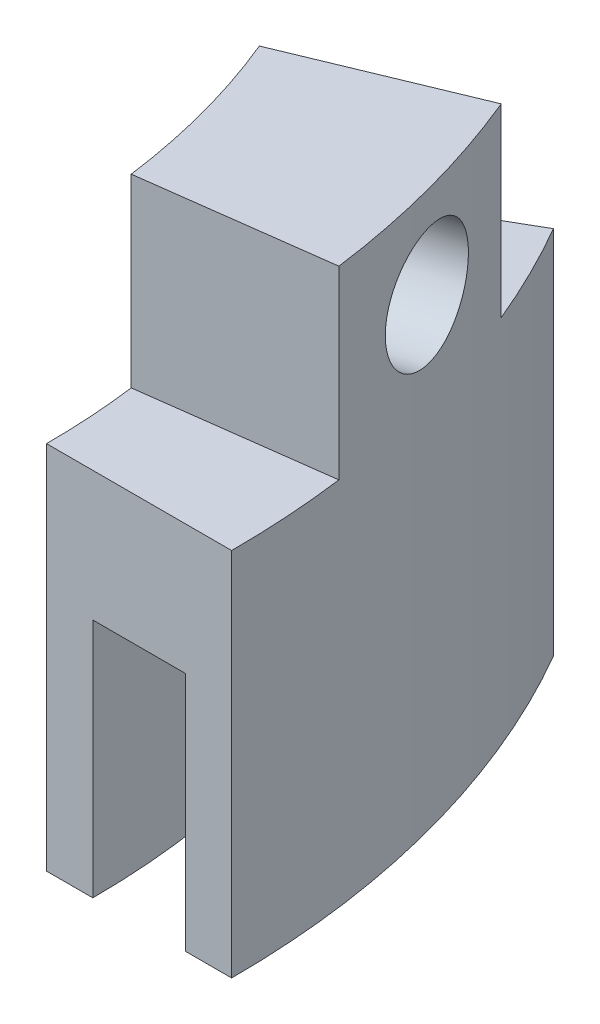
ISO-10303-21;
HEADER;
FILE_DESCRIPTION(('STEP AP214'),'2;1');
FILE_NAME('part.step','',(''),(''),'','','');
FILE_SCHEMA(('AUTOMOTIVE_DESIGN { 1 0 10303 214 1 1 1 1 }'));
ENDSEC;
DATA;
#1=APPLICATION_CONTEXT('core data for automotive mechanical design processes');
#2=APPLICATION_PROTOCOL_DEFINITION('international standard','automotive_design',2000,#1);
#3=PRODUCT_CONTEXT('',#1,'mechanical');
#4=PRODUCT('Part','Part','',(#3));
#5=PRODUCT_RELATED_PRODUCT_CATEGORY('part','',(#4));
#6=PRODUCT_DEFINITION_FORMATION('','',#4);
#7=PRODUCT_DEFINITION_CONTEXT('part definition',#1,'design');
#8=PRODUCT_DEFINITION('design','',#6,#7);
#9=PRODUCT_DEFINITION_SHAPE('','',#8);
#10=(LENGTH_UNIT() NAMED_UNIT(*) SI_UNIT(.MILLI.,.METRE.));
#11=(NAMED_UNIT(*) PLANE_ANGLE_UNIT() SI_UNIT($,.RADIAN.));
#12=(NAMED_UNIT(*) SI_UNIT($,.STERADIAN.) SOLID_ANGLE_UNIT());
#13=UNCERTAINTY_MEASURE_WITH_UNIT(LENGTH_MEASURE(1.E-05),#10,'distance_accuracy_value','');
#14=(GEOMETRIC_REPRESENTATION_CONTEXT(3) GLOBAL_UNCERTAINTY_ASSIGNED_CONTEXT((#13)) GLOBAL_UNIT_ASSIGNED_CONTEXT((#10,
#11,#12)) REPRESENTATION_CONTEXT('',''));
#15=CARTESIAN_POINT('',(0.,0.,0.));
#16=DIRECTION('',(0.,0.,1.));
#17=DIRECTION('',(1.,0.,0.));
#18=AXIS2_PLACEMENT_3D('',#15,#16,#17);
#19=CARTESIAN_POINT('',(37.5,30.,0.));
#20=DIRECTION('',(0.,0.,-1.));
#21=DIRECTION('',(-1.,0.,0.));
#22=AXIS2_PLACEMENT_3D('',#19,#20,#21);
#23=PLANE('',#22);
#24=DIRECTION('',(-1.,0.,0.));
#25=VECTOR('',#24,1.);
#26=CARTESIAN_POINT('',(47.5,20.,0.));
#27=LINE('',#26,#25);
#28=CARTESIAN_POINT('',(47.5,20.,0.));
#29=VERTEX_POINT('',#28);
#30=CARTESIAN_POINT('',(37.5,20.,0.));
#31=VERTEX_POINT('',#30);
#32=EDGE_CURVE('E144',#29,#31,#27,.T.);
#33=ORIENTED_EDGE('',*,*,#32,.T.);
#34=DIRECTION('',(0.,-1.,0.));
#35=VECTOR('',#34,1.);
#36=CARTESIAN_POINT('',(37.5,30.,0.));
#37=LINE('',#36,#35);
#38=CARTESIAN_POINT('',(37.5,0.,0.));
#39=VERTEX_POINT('',#38);
#40=EDGE_CURVE('E50',#31,#39,#37,.T.);
#41=ORIENTED_EDGE('',*,*,#40,.T.);
#42=DIRECTION('',(1.,0.,0.));
#43=VECTOR('',#42,1.);
#44=CARTESIAN_POINT('',(37.5,0.,0.));
#45=LINE('',#44,#43);
#46=CARTESIAN_POINT('',(40.,0.,0.));
#47=VERTEX_POINT('',#46);
#48=EDGE_CURVE('E209',#39,#47,#45,.T.);
#49=ORIENTED_EDGE('',*,*,#48,.T.);
#50=DIRECTION('',(0.,-1.,0.));
#51=VECTOR('',#50,1.);
#52=CARTESIAN_POINT('',(40.,13.,0.));
#53=LINE('',#52,#51);
#54=CARTESIAN_POINT('',(40.,13.,0.));
#55=VERTEX_POINT('',#54);
#56=EDGE_CURVE('E197',#55,#47,#53,.T.);
#57=ORIENTED_EDGE('',*,*,#56,.F.);
#58=DIRECTION('',(1.,0.,0.));
#59=VECTOR('',#58,1.);
#60=CARTESIAN_POINT('',(40.,13.,0.));
#61=LINE('',#60,#59);
#62=CARTESIAN_POINT('',(45.,13.,0.));
#63=VERTEX_POINT('',#62);
#64=EDGE_CURVE('E176',#55,#63,#61,.T.);
#65=ORIENTED_EDGE('',*,*,#64,.T.);
#66=DIRECTION('',(0.,-1.,0.));
#67=VECTOR('',#66,1.);
#68=CARTESIAN_POINT('',(45.,13.,0.));
#69=LINE('',#68,#67);
#70=CARTESIAN_POINT('',(45.,0.,0.));
#71=VERTEX_POINT('',#70);
#72=EDGE_CURVE('E194',#63,#71,#69,.T.);
#73=ORIENTED_EDGE('',*,*,#72,.T.);
#74=CARTESIAN_POINT('',(47.5,0.,0.));
#75=VERTEX_POINT('',#74);
#76=EDGE_CURVE('E208',#71,#75,#45,.T.);
#77=ORIENTED_EDGE('',*,*,#76,.T.);
#78=DIRECTION('',(0.,-1.,0.));
#79=VECTOR('',#78,1.);
#80=CARTESIAN_POINT('',(47.5,30.,0.));
#81=LINE('',#80,#79);
#82=EDGE_CURVE('E221',#29,#75,#81,.T.);
#83=ORIENTED_EDGE('',*,*,#82,.F.);
#84=EDGE_LOOP('',(#33,#41,#49,#57,#65,#73,#77,#83));
#85=FACE_BOUND('',#84,.T.);
#86=ADVANCED_FACE('F36',(#85),#23,.F.);
#87=CARTESIAN_POINT('',(0.,30.,0.));
#88=DIRECTION('',(0.,-1.,0.));
#89=DIRECTION('',(0.,0.,-1.));
#90=AXIS2_PLACEMENT_3D('',#87,#88,#89);
#91=CYLINDRICAL_SURFACE('',#90,37.5);
#92=CARTESIAN_POINT('',(35.2704060324565,25.,-12.7376786859166));
#93=CARTESIAN_POINT('',(35.2704097653844,25.1779978891608,-12.7376716408698));
#94=CARTESIAN_POINT('',(35.2755349748384,25.3561167010307,-12.7235043498026));
#95=CARTESIAN_POINT('',(35.2958024335006,25.7074252721116,-12.6671698499681));
#96=CARTESIAN_POINT('',(35.310956009995,25.8806092262858,-12.6249709786409));
#97=CARTESIAN_POINT('',(35.3505338022705,26.2169091534095,-12.5137214601811));
#98=CARTESIAN_POINT('',(35.3749527353968,26.3800308018977,-12.4446861133498));
#99=CARTESIAN_POINT('',(35.4318935830824,26.69166654265,-12.2816260753014));
#100=CARTESIAN_POINT('',(35.4644137742792,26.8401837323281,-12.1876066985978));
#101=CARTESIAN_POINT('',(35.5361514233242,27.1188261762729,-11.9768246317122));
#102=CARTESIAN_POINT('',(35.5753844170809,27.2489074566124,-11.8600090925989));
#103=CARTESIAN_POINT('',(35.658768247816,27.4866077028728,-11.6068930067202));
#104=CARTESIAN_POINT('',(35.7029193002565,27.5942256840735,-11.4705916061972));
#105=CARTESIAN_POINT('',(35.7943662403452,27.7840912508375,-11.1819614568014));
#106=CARTESIAN_POINT('',(35.8416667259955,27.8663007084706,-11.0296090768136));
#107=CARTESIAN_POINT('',(35.9375032521241,28.0027717156793,-10.7132232423583));
#108=CARTESIAN_POINT('',(35.9860392703385,28.0570337684841,-10.5491899982805));
#109=CARTESIAN_POINT('',(36.0824862424699,28.1359428644353,-10.2144231425898));
#110=CARTESIAN_POINT('',(36.1303984234407,28.1606611562039,-10.0437066804902));
#111=CARTESIAN_POINT('',(36.2241803613751,28.1800013365684,-9.70002470119819));
#112=CARTESIAN_POINT('',(36.2700501574028,28.1746238010489,-9.52705922710394));
#113=CARTESIAN_POINT('',(36.3583621276763,28.1339832131042,-9.18426699791521));
#114=CARTESIAN_POINT('',(36.4008127840267,28.0987967778475,-9.01443333559827));
#115=CARTESIAN_POINT('',(36.4814547002396,27.9996563534648,-8.68232021854286));
#116=CARTESIAN_POINT('',(36.5196459184645,27.9357020831535,-8.52004083765927));
#117=CARTESIAN_POINT('',(36.591152506488,27.7807561260629,-8.20751588121255));
#118=CARTESIAN_POINT('',(36.6244616132793,27.6897301558397,-8.05728587305103));
#119=CARTESIAN_POINT('',(36.6857555613364,27.4832495856142,-7.77344556382491));
#120=CARTESIAN_POINT('',(36.7137402910436,27.3677944738694,-7.63983561101087));
#121=CARTESIAN_POINT('',(36.7642925057259,27.1153012158688,-7.39275221368527));
#122=CARTESIAN_POINT('',(36.7868427184138,26.9781964886148,-7.27934326347325));
#123=CARTESIAN_POINT('',(36.8263918552036,26.6865278463528,-7.07655084451197));
#124=CARTESIAN_POINT('',(36.8433907745121,26.5319639162695,-6.98716739650801));
#125=CARTESIAN_POINT('',(36.871903253683,26.2097171671351,-6.83511267389838));
#126=CARTESIAN_POINT('',(36.883416105588,26.0420326581687,-6.77244484695834));
#127=CARTESIAN_POINT('',(36.901038571056,25.6983272854993,-6.67576128321446));
#128=CARTESIAN_POINT('',(36.9071483019301,25.5223066028764,-6.64174492433843));
#129=CARTESIAN_POINT('',(36.9140145581421,25.1675098476037,-6.60347738194785));
#130=CARTESIAN_POINT('',(36.9147876263553,24.9887440130366,-6.59913421629608));
#131=CARTESIAN_POINT('',(36.9110327318272,24.6330181011827,-6.62010360202808));
#132=CARTESIAN_POINT('',(36.9065048201497,24.456058006518,-6.64541586774397));
#133=CARTESIAN_POINT('',(36.8921124053528,24.1092344846523,-6.72485322684918));
#134=CARTESIAN_POINT('',(36.8822558492378,23.9393608941768,-6.77893541159788));
#135=CARTESIAN_POINT('',(36.8571301596593,23.61121756518,-6.91423628346922));
#136=CARTESIAN_POINT('',(36.8418609365965,23.4529480188003,-6.99545541980593));
#137=CARTESIAN_POINT('',(36.8057900762903,23.1520794266476,-7.18282022182036));
#138=CARTESIAN_POINT('',(36.7849749694499,23.009519744213,-7.28902650069915));
#139=CARTESIAN_POINT('',(36.7378166112305,22.7445155632007,-7.52310090241077));
#140=CARTESIAN_POINT('',(36.7114732616809,22.622071421904,-7.65096940991407));
#141=CARTESIAN_POINT('',(36.6533017913043,22.4004559414546,-7.92496656070223));
#142=CARTESIAN_POINT('',(36.6214597694007,22.3013451292424,-8.07114121956292));
#143=CARTESIAN_POINT('',(36.5526595330129,22.129625086973,-8.37721019714513));
#144=CARTESIAN_POINT('',(36.5157013710748,22.0570155847572,-8.53710437495147));
#145=CARTESIAN_POINT('',(36.437304422082,21.9404631237462,-8.86573866446494));
#146=CARTESIAN_POINT('',(36.3958715578333,21.8964828000683,-9.03446693432316));
#147=CARTESIAN_POINT('',(36.3093686696427,21.8383150280743,-9.37607470537412));
#148=CARTESIAN_POINT('',(36.2642987170066,21.8241269958212,-9.54895412513603));
#149=CARTESIAN_POINT('',(36.1718569325052,21.8259534651701,-9.89335425158622));
#150=CARTESIAN_POINT('',(36.1244927390473,21.8418736653132,-10.0648775165041));
#151=CARTESIAN_POINT('',(36.0287882203176,21.9032679530679,-10.4022680294759));
#152=CARTESIAN_POINT('',(35.9804478937554,21.948742079748,-10.5681352700524));
#153=CARTESIAN_POINT('',(35.8844665121526,22.0679292432081,-10.8895924155276));
#154=CARTESIAN_POINT('',(35.8368254133026,22.1416405029097,-11.045182966458));
#155=CARTESIAN_POINT('',(35.7440435832514,22.3151988006724,-11.3418488536084));
#156=CARTESIAN_POINT('',(35.6989028143671,22.4150454447114,-11.4829244086144));
#157=CARTESIAN_POINT('',(35.6128266822784,22.6383942434046,-11.7471689313545));
#158=CARTESIAN_POINT('',(35.5719042956936,22.7619662296959,-11.8702831017985));
#159=CARTESIAN_POINT('',(35.4961846180603,23.0291306432559,-12.0948319233656));
#160=CARTESIAN_POINT('',(35.4613888117427,23.1727279084336,-12.1962613206179));
#161=CARTESIAN_POINT('',(35.3994594406154,23.4761541158721,-12.3748637066046));
#162=CARTESIAN_POINT('',(35.3723407289385,23.636013720463,-12.4519897068952));
#163=CARTESIAN_POINT('',(35.3271692387112,23.9670953803168,-12.5795761749517));
#164=CARTESIAN_POINT('',(35.3091060526232,24.1383041344437,-12.6300672577978));
#165=CARTESIAN_POINT('',(35.28752135546,24.4254333749889,-12.6902098217164));
#166=CARTESIAN_POINT('',(35.2811166952536,24.5395079589269,-12.7079882841098));
#167=CARTESIAN_POINT('',(35.2725578284966,24.769038057731,-12.7317249855531));
#168=CARTESIAN_POINT('',(35.2704036100842,24.8844935687424,-12.73768325759));
#169=CARTESIAN_POINT('',(35.2704060324565,25.,-12.7376786859166));
#170=B_SPLINE_CURVE_WITH_KNOTS('',3,(#92,#93,#94,#95,#96,#97,#98,#99,#100,#101,#102,#103,#104,
#105,#106,#107,#108,#109,#110,#111,#112,#113,#114,#115,#116,#117,#118,#119,#120,#121,#122,#123,
#124,#125,#126,#127,#128,#129,#130,#131,#132,#133,#134,#135,#136,#137,#138,#139,#140,#141,#142,
#143,#144,#145,#146,#147,#148,#149,#150,#151,#152,#153,#154,#155,#156,#157,#158,#159,#160,#161,
#162,#163,#164,#165,#166,#167,#168,#169),.UNSPECIFIED.,.T.,.F.,(4,2,2,2,2,2,2,2,2,2,2,2,2,2,2,2,
2,2,2,2,2,2,2,2,2,2,2,2,2,2,2,2,2,2,2,2,2,2,4),(0.,0.533571926366941,1.06774756630856,
1.60161910186992,2.13537716496338,2.67038767753384,3.2054216383574,3.74125461404554,
4.27707794102814,4.81160643609804,5.34612470298305,5.87927326287136,6.41242703402442,
6.94625888407069,7.48010191795112,8.01561990371666,8.55113835188457,9.08672588809823,
9.62230179549409,10.1562167472371,10.6901265558716,11.2232422928354,11.7563668552177,
12.2907982405197,12.8252391170668,13.3610514295973,13.8968582393801,14.4319643405063,
14.9670599533105,15.5004823777874,16.0339055074187,16.5672950720633,17.1006765956896,
17.6356527982051,18.1707584702988,18.7068924621637,19.2424088531516,19.5886554368666,
19.9349010542976),.UNSPECIFIED.);
#171=CARTESIAN_POINT('',(35.2704060324565,25.,-12.7376786859166));
#172=VERTEX_POINT('',#171);
#173=EDGE_CURVE('E260',#172,#172,#170,.T.);
#174=ORIENTED_EDGE('',*,*,#173,.T.);
#175=EDGE_LOOP('',(#174));
#176=FACE_BOUND('',#175,.T.);
#177=DIRECTION('',(0.,1.,0.));
#178=VECTOR('',#177,1.);
#179=CARTESIAN_POINT('',(37.1791823015179,20.,-4.8947322082519));
#180=LINE('',#179,#178);
#181=CARTESIAN_POINT('',(37.1791823015179,20.,-4.8947322082519));
#182=VERTEX_POINT('',#181);
#183=CARTESIAN_POINT('',(37.1791823015179,30.,-4.8947322082519));
#184=VERTEX_POINT('',#183);
#185=EDGE_CURVE('E135',#182,#184,#180,.T.);
#186=ORIENTED_EDGE('',*,*,#185,.T.);
#187=CARTESIAN_POINT('',(0.,30.,0.));
#188=DIRECTION('',(0.,-1.,0.));
#189=DIRECTION('',(0.,0.,1.));
#190=AXIS2_PLACEMENT_3D('',#187,#188,#189);
#191=CIRCLE('',#190,37.5);
#192=CARTESIAN_POINT('',(34.6454824691732,30.,-14.3506287136909));
#193=VERTEX_POINT('',#192);
#194=EDGE_CURVE('E200',#193,#184,#191,.T.);
#195=ORIENTED_EDGE('',*,*,#194,.F.);
#196=DIRECTION('',(0.,1.,0.));
#197=VECTOR('',#196,1.);
#198=CARTESIAN_POINT('',(34.6454824691732,20.,-14.3506287136909));
#199=LINE('',#198,#197);
#200=CARTESIAN_POINT('',(34.6454824691732,20.,-14.3506287136909));
#201=VERTEX_POINT('',#200);
#202=EDGE_CURVE('E65',#201,#193,#199,.T.);
#203=ORIENTED_EDGE('',*,*,#202,.F.);
#204=CARTESIAN_POINT('',(0.,20.,0.));
#205=DIRECTION('',(0.,-1.,0.));
#206=DIRECTION('',(0.,0.,1.));
#207=AXIS2_PLACEMENT_3D('',#204,#205,#206);
#208=CIRCLE('',#207,37.5);
#209=CARTESIAN_POINT('',(32.4759526419164,20.,-18.75));
#210=VERTEX_POINT('',#209);
#211=EDGE_CURVE('E163',#210,#201,#208,.T.);
#212=ORIENTED_EDGE('',*,*,#211,.F.);
#213=DIRECTION('',(0.,-1.,0.));
#214=VECTOR('',#213,1.);
#215=CARTESIAN_POINT('',(32.4759526419164,30.,-18.75));
#216=LINE('',#215,#214);
#217=CARTESIAN_POINT('',(32.4759526419164,0.,-18.75));
#218=VERTEX_POINT('',#217);
#219=EDGE_CURVE('E205',#210,#218,#216,.T.);
#220=ORIENTED_EDGE('',*,*,#219,.T.);
#221=CARTESIAN_POINT('',(0.,0.,0.));
#222=DIRECTION('',(0.,-1.,0.));
#223=DIRECTION('',(0.,0.,1.));
#224=AXIS2_PLACEMENT_3D('',#221,#222,#223);
#225=CIRCLE('',#224,37.5);
#226=EDGE_CURVE('E199',#218,#39,#225,.T.);
#227=ORIENTED_EDGE('',*,*,#226,.T.);
#228=ORIENTED_EDGE('',*,*,#40,.F.);
#229=CARTESIAN_POINT('',(0.,20.,0.));
#230=DIRECTION('',(0.,1.,0.));
#231=DIRECTION('',(-0.500000000000001,0.,-0.866025403784438));
#232=AXIS2_PLACEMENT_3D('',#229,#230,#231);
#233=CIRCLE('',#232,37.5);
#234=EDGE_CURVE('E138',#31,#182,#233,.T.);
#235=ORIENTED_EDGE('',*,*,#234,.T.);
#236=EDGE_LOOP('',(#186,#195,#203,#212,#220,#227,#228,#235));
#237=FACE_BOUND('',#236,.T.);
#238=ADVANCED_FACE('F38',(#176,#237),#91,.F.);
#239=CARTESIAN_POINT('',(0.,30.,0.));
#240=DIRECTION('',(0.,-1.,0.));
#241=DIRECTION('',(0.,0.,-1.));
#242=AXIS2_PLACEMENT_3D('',#239,#240,#241);
#243=CYLINDRICAL_SURFACE('',#242,47.5);
#244=CARTESIAN_POINT('',(44.9571153704844,25.,-15.3332246303561));
#245=CARTESIAN_POINT('',(44.9571187668989,24.8218727170466,-15.3332174361785));
#246=CARTESIAN_POINT('',(44.9619886090917,24.6436213477172,-15.3189592163519));
#247=CARTESIAN_POINT('',(44.9812644094683,24.2920424228411,-15.2622643802337));
#248=CARTESIAN_POINT('',(44.995681412819,24.1187208130721,-15.219795126254));
#249=CARTESIAN_POINT('',(45.0333944950656,23.7821448482159,-15.1078406403738));
#250=CARTESIAN_POINT('',(45.0566858228782,23.6188851604766,-15.0383698639897));
#251=CARTESIAN_POINT('',(45.111111088111,23.3070005572629,-14.8743097257609));
#252=CARTESIAN_POINT('',(45.142243251731,23.1583723423333,-14.7797260448441));
#253=CARTESIAN_POINT('',(45.2110693614084,22.8796750858532,-14.5678275116204));
#254=CARTESIAN_POINT('',(45.2487730882863,22.7496342415522,-14.4504787469334));
#255=CARTESIAN_POINT('',(45.3291547528529,22.5120446398517,-14.1963184218899));
#256=CARTESIAN_POINT('',(45.3718328996932,22.4044968287126,-14.0595060431245));
#257=CARTESIAN_POINT('',(45.4605259195841,22.2148580644146,-13.7700212845367));
#258=CARTESIAN_POINT('',(45.5065438297487,22.1327906497476,-13.6173344127912));
#259=CARTESIAN_POINT('',(45.6001749156534,21.9965929455987,-13.3004255135691));
#260=CARTESIAN_POINT('',(45.64778807231,21.9424623220415,-13.136203624058));
#261=CARTESIAN_POINT('',(45.7428989305853,21.8637535796711,-12.8010732040241));
#262=CARTESIAN_POINT('',(45.7903966980237,21.8391310071299,-12.6301751332535));
#263=CARTESIAN_POINT('',(45.8838625199052,21.8200000043306,-12.2862892396115));
#264=CARTESIAN_POINT('',(45.9298305936583,21.8254911937878,-12.1133014431573));
#265=CARTESIAN_POINT('',(46.0188866345685,21.8663952317931,-11.7704461717246));
#266=CARTESIAN_POINT('',(46.0619790855201,21.9017602649988,-11.6005741533717));
#267=CARTESIAN_POINT('',(46.1443334263227,22.0013338785164,-11.2685301791647));
#268=CARTESIAN_POINT('',(46.183595290933,22.0655426488711,-11.1063582740521));
#269=CARTESIAN_POINT('',(46.2575376526101,22.2210350718874,-10.7942567898834));
#270=CARTESIAN_POINT('',(46.2922144589287,22.3123403464186,-10.6443371098954));
#271=CARTESIAN_POINT('',(46.3564038646079,22.519418233548,-10.361222219855));
#272=CARTESIAN_POINT('',(46.3859163972114,22.6351911623899,-10.2280272260042));
#273=CARTESIAN_POINT('',(46.4394832919698,22.8881879374392,-9.98199931411864));
#274=CARTESIAN_POINT('',(46.4635268662361,23.0254532941587,-9.86920672938207));
#275=CARTESIAN_POINT('',(46.5058875622847,23.3173931764798,-9.66762978139927));
#276=CARTESIAN_POINT('',(46.5242046814203,23.472067710128,-9.57884542924983));
#277=CARTESIAN_POINT('',(46.5550235806884,23.7944623562233,-9.42792352642444));
#278=CARTESIAN_POINT('',(46.5675249693619,23.9621833459457,-9.36578776949785));
#279=CARTESIAN_POINT('',(46.586679435613,24.3058974189124,-9.27004335561848));
#280=CARTESIAN_POINT('',(46.5933325919434,24.4818903907321,-9.23643431452387));
#281=CARTESIAN_POINT('',(46.6007776837091,24.8367882327187,-9.19879852644343));
#282=CARTESIAN_POINT('',(46.6015809302342,25.0156868127678,-9.19471469112511));
#283=CARTESIAN_POINT('',(46.5973558838729,25.3716378877592,-9.21610215042586));
#284=CARTESIAN_POINT('',(46.5923276257594,25.5486903937032,-9.24157326881031));
#285=CARTESIAN_POINT('',(46.5764500807797,25.8957587744632,-9.32126220165982));
#286=CARTESIAN_POINT('',(46.5656061249852,26.0657809402785,-9.37545368850772));
#287=CARTESIAN_POINT('',(46.5381214970428,26.3941566410379,-9.51094096276121));
#288=CARTESIAN_POINT('',(46.5214807647812,26.5525100549545,-9.59223703124576));
#289=CARTESIAN_POINT('',(46.4824411600192,26.8533197380915,-9.7796628890173));
#290=CARTESIAN_POINT('',(46.4600334975505,26.9957512595443,-9.88583056529914));
#291=CARTESIAN_POINT('',(46.4096312497907,27.2604245975693,-10.1198028848125));
#292=CARTESIAN_POINT('',(46.3816366021736,27.3826661888836,-10.2476077694167));
#293=CARTESIAN_POINT('',(46.3203096229611,27.6036862096596,-10.5213393873906));
#294=CARTESIAN_POINT('',(46.2869688772683,27.7024270329566,-10.6672946044873));
#295=CARTESIAN_POINT('',(46.2154706029459,27.873385167033,-10.9729154273159));
#296=CARTESIAN_POINT('',(46.1773131074825,27.9456026604285,-11.1325809386414));
#297=CARTESIAN_POINT('',(46.0969329405165,28.0613988837534,-11.460858736013));
#298=CARTESIAN_POINT('',(46.0547136663557,28.1050013131004,-11.6294634930273));
#299=CARTESIAN_POINT('',(45.9671516423718,28.1624072360458,-11.9708819515651));
#300=CARTESIAN_POINT('',(45.9218089285259,28.1762110728192,-12.1436956045938));
#301=CARTESIAN_POINT('',(45.8293077611885,28.173624537442,-12.4882467935225));
#302=CARTESIAN_POINT('',(45.7821530194752,28.1572929713933,-12.6599857704587));
#303=CARTESIAN_POINT('',(45.6873731237853,28.095021282724,-12.9978743727564));
#304=CARTESIAN_POINT('',(45.6397479690106,28.0490811098496,-13.1640239886307));
#305=CARTESIAN_POINT('',(45.5456204380541,27.9289099024438,-13.486090241278));
#306=CARTESIAN_POINT('',(45.4991180455961,27.8546792782925,-13.6420070264494));
#307=CARTESIAN_POINT('',(45.4089181725618,27.6800420813512,-13.9393082245091));
#308=CARTESIAN_POINT('',(45.3652206245557,27.5796361381228,-14.0806929868036));
#309=CARTESIAN_POINT('',(45.2822367875387,27.3552800118789,-14.3453244078452));
#310=CARTESIAN_POINT('',(45.2429587271355,27.2312870301517,-14.4685373609352));
#311=CARTESIAN_POINT('',(45.1704983664336,26.9633394854515,-14.6931974367829));
#312=CARTESIAN_POINT('',(45.1373175572827,26.8193800545357,-14.7946392361887));
#313=CARTESIAN_POINT('',(45.0784365631933,26.5154006883772,-14.9730900787958));
#314=CARTESIAN_POINT('',(45.0527465801876,26.3553592455988,-15.0500658138075));
#315=CARTESIAN_POINT('',(45.0100662158975,26.0240300784201,-15.1772356108915));
#316=CARTESIAN_POINT('',(44.9930656807598,25.852755745355,-15.2274609344368));
#317=CARTESIAN_POINT('',(44.9729368501191,25.5670335490145,-15.2867755169555));
#318=CARTESIAN_POINT('',(44.9670152770581,25.4544309955258,-15.3041723050184));
#319=CARTESIAN_POINT('',(44.959103453802,25.227902561161,-15.3273991540059));
#320=CARTESIAN_POINT('',(44.9571131972515,25.1139766824243,-15.3332292336291));
#321=CARTESIAN_POINT('',(44.9571153704844,25.,-15.3332246303561));
#322=B_SPLINE_CURVE_WITH_KNOTS('',3,(#244,#245,#246,#247,#248,#249,#250,#251,#252,#253,#254,
#255,#256,#257,#258,#259,#260,#261,#262,#263,#264,#265,#266,#267,#268,#269,#270,#271,#272,#273,
#274,#275,#276,#277,#278,#279,#280,#281,#282,#283,#284,#285,#286,#287,#288,#289,#290,#291,#292,
#293,#294,#295,#296,#297,#298,#299,#300,#301,#302,#303,#304,#305,#306,#307,#308,#309,#310,#311,
#312,#313,#314,#315,#316,#317,#318,#319,#320,#321),.UNSPECIFIED.,.T.,.F.,(4,2,2,2,2,2,2,2,2,2,2,
2,2,2,2,2,2,2,2,2,2,2,2,2,2,2,2,2,2,2,2,2,2,2,2,2,2,2,4),(0.,0.533965751443998,1.068550332758,
1.60284911257561,2.13702712856383,2.67200708827642,3.20700954955924,3.74250477937393,
4.27799360545142,4.81267470215686,5.34734904677667,5.88116922272522,6.41499291590715,
6.94924372855675,7.48350144680507,8.01880405757494,8.55410691576564,9.08944580018987,
9.62477747560614,10.1590737852916,10.6933669090132,11.2271710976484,11.7609808220927,
12.2956090495492,12.8302432414173,13.3657272931511,13.9012076579468,14.4362439684442,
14.971274117171,15.5052613141995,16.0392494175498,16.5732297751858,17.1071972908547,
17.6421430960463,18.177219554326,18.7130213780739,19.248195663352,19.5898600184957,
19.9315238213043),.UNSPECIFIED.);
#323=CARTESIAN_POINT('',(44.9571153704844,25.,-15.3332246303561));
#324=VERTEX_POINT('',#323);
#325=EDGE_CURVE('E11',#324,#324,#322,.T.);
#326=ORIENTED_EDGE('',*,*,#325,.T.);
#327=EDGE_LOOP('',(#326));
#328=FACE_BOUND('',#327,.T.);
#329=DIRECTION('',(0.,1.,0.));
#330=VECTOR('',#329,1.);
#331=CARTESIAN_POINT('',(47.093630915256,20.,-6.19999413045242));
#332=LINE('',#331,#330);
#333=CARTESIAN_POINT('',(47.093630915256,20.,-6.19999413045242));
#334=VERTEX_POINT('',#333);
#335=CARTESIAN_POINT('',(47.093630915256,30.,-6.19999413045242));
#336=VERTEX_POINT('',#335);
#337=EDGE_CURVE('E57',#334,#336,#332,.T.);
#338=ORIENTED_EDGE('',*,*,#337,.F.);
#339=CARTESIAN_POINT('',(0.,20.,0.));
#340=DIRECTION('',(0.,-1.,0.));
#341=DIRECTION('',(-0.500000000000001,0.,-0.866025403784438));
#342=AXIS2_PLACEMENT_3D('',#339,#340,#341);
#343=CIRCLE('',#342,47.5);
#344=EDGE_CURVE('E139',#334,#29,#343,.T.);
#345=ORIENTED_EDGE('',*,*,#344,.T.);
#346=ORIENTED_EDGE('',*,*,#82,.T.);
#347=CARTESIAN_POINT('',(0.,0.,0.));
#348=DIRECTION('',(0.,1.,0.));
#349=DIRECTION('',(0.,0.,1.));
#350=AXIS2_PLACEMENT_3D('',#347,#348,#349);
#351=CIRCLE('',#350,47.5);
#352=CARTESIAN_POINT('',(41.1362066797608,0.,-23.7500000000001));
#353=VERTEX_POINT('',#352);
#354=EDGE_CURVE('E212',#75,#353,#351,.T.);
#355=ORIENTED_EDGE('',*,*,#354,.T.);
#356=DIRECTION('',(0.,-1.,0.));
#357=VECTOR('',#356,1.);
#358=CARTESIAN_POINT('',(41.1362066797608,30.,-23.7500000000001));
#359=LINE('',#358,#357);
#360=CARTESIAN_POINT('',(41.1362066797608,20.,-23.7500000000001));
#361=VERTEX_POINT('',#360);
#362=EDGE_CURVE('E219',#361,#353,#359,.T.);
#363=ORIENTED_EDGE('',*,*,#362,.F.);
#364=CARTESIAN_POINT('',(0.,20.,0.));
#365=DIRECTION('',(0.,1.,0.));
#366=DIRECTION('',(0.,0.,1.));
#367=AXIS2_PLACEMENT_3D('',#364,#365,#366);
#368=CIRCLE('',#367,47.5);
#369=CARTESIAN_POINT('',(43.8842777942861,20.,-18.1774630373418));
#370=VERTEX_POINT('',#369);
#371=EDGE_CURVE('E159',#370,#361,#368,.T.);
#372=ORIENTED_EDGE('',*,*,#371,.F.);
#373=DIRECTION('',(0.,1.,0.));
#374=VECTOR('',#373,1.);
#375=CARTESIAN_POINT('',(43.8842777942861,20.,-18.1774630373418));
#376=LINE('',#375,#374);
#377=CARTESIAN_POINT('',(43.8842777942861,30.,-18.1774630373418));
#378=VERTEX_POINT('',#377);
#379=EDGE_CURVE('E169',#370,#378,#376,.T.);
#380=ORIENTED_EDGE('',*,*,#379,.T.);
#381=CARTESIAN_POINT('',(0.,30.,0.));
#382=DIRECTION('',(0.,1.,0.));
#383=DIRECTION('',(0.,0.,1.));
#384=AXIS2_PLACEMENT_3D('',#381,#382,#383);
#385=CIRCLE('',#384,47.5);
#386=EDGE_CURVE('E152',#336,#378,#385,.T.);
#387=ORIENTED_EDGE('',*,*,#386,.F.);
#388=EDGE_LOOP('',(#338,#345,#346,#355,#363,#372,#380,#387));
#389=FACE_BOUND('',#388,.T.);
#390=ADVANCED_FACE('F150',(#328,#389),#243,.T.);
#391=CARTESIAN_POINT('',(0.,30.,0.));
#392=DIRECTION('',(0.,1.,0.));
#393=DIRECTION('',(0.,0.,1.));
#394=AXIS2_PLACEMENT_3D('',#391,#392,#393);
#395=PLANE('',#394);
#396=ORIENTED_EDGE('',*,*,#194,.T.);
#397=DIRECTION('',(0.99144486137381,0.,-0.130526192220051));
#398=VECTOR('',#397,1.);
#399=CARTESIAN_POINT('',(47.093630915256,30.,-6.19999413045242));
#400=LINE('',#399,#398);
#401=EDGE_CURVE('E147',#184,#336,#400,.T.);
#402=ORIENTED_EDGE('',*,*,#401,.T.);
#403=ORIENTED_EDGE('',*,*,#386,.T.);
#404=DIRECTION('',(0.923879532511286,0.,-0.382683432365091));
#405=VECTOR('',#404,1.);
#406=CARTESIAN_POINT('',(43.8842777942861,30.,-18.1774630373418));
#407=LINE('',#406,#405);
#408=EDGE_CURVE('E154',#193,#378,#407,.T.);
#409=ORIENTED_EDGE('',*,*,#408,.F.);
#410=EDGE_LOOP('',(#396,#402,#403,#409));
#411=FACE_BOUND('',#410,.T.);
#412=ADVANCED_FACE('F259',(#411),#395,.T.);
#413=CARTESIAN_POINT('',(32.4759526419164,30.,-18.75));
#414=DIRECTION('',(0.500000000000001,0.,0.866025403784438));
#415=DIRECTION('',(0.866025403784438,0.,-0.500000000000001));
#416=AXIS2_PLACEMENT_3D('',#413,#414,#415);
#417=PLANE('',#416);
#418=DIRECTION('',(-0.866025403784438,0.,0.500000000000001));
#419=VECTOR('',#418,1.);
#420=CARTESIAN_POINT('',(41.1362066797608,20.,-23.7500000000001));
#421=LINE('',#420,#419);
#422=EDGE_CURVE('E161',#361,#210,#421,.T.);
#423=ORIENTED_EDGE('',*,*,#422,.F.);
#424=ORIENTED_EDGE('',*,*,#362,.T.);
#425=DIRECTION('',(-0.866025403784438,0.,0.500000000000001));
#426=VECTOR('',#425,1.);
#427=CARTESIAN_POINT('',(32.4759526419164,0.,-18.75));
#428=LINE('',#427,#426);
#429=CARTESIAN_POINT('',(38.9711431702997,0.,-22.5));
#430=VERTEX_POINT('',#429);
#431=EDGE_CURVE('E203',#353,#430,#428,.T.);
#432=ORIENTED_EDGE('',*,*,#431,.T.);
#433=DIRECTION('',(0.,-1.,0.));
#434=VECTOR('',#433,1.);
#435=CARTESIAN_POINT('',(38.9711431702997,13.,-22.5));
#436=LINE('',#435,#434);
#437=CARTESIAN_POINT('',(38.9711431702997,13.,-22.5));
#438=VERTEX_POINT('',#437);
#439=EDGE_CURVE('E192',#438,#430,#436,.T.);
#440=ORIENTED_EDGE('',*,*,#439,.F.);
#441=DIRECTION('',(-0.866025403784438,0.,0.500000000000001));
#442=VECTOR('',#441,1.);
#443=CARTESIAN_POINT('',(34.6410161513775,13.,-20.));
#444=LINE('',#443,#442);
#445=CARTESIAN_POINT('',(34.6410161513775,13.,-20.));
#446=VERTEX_POINT('',#445);
#447=EDGE_CURVE('E182',#438,#446,#444,.T.);
#448=ORIENTED_EDGE('',*,*,#447,.T.);
#449=DIRECTION('',(0.,-1.,0.));
#450=VECTOR('',#449,1.);
#451=CARTESIAN_POINT('',(34.6410161513775,13.,-20.));
#452=LINE('',#451,#450);
#453=CARTESIAN_POINT('',(34.6410161513775,0.,-20.));
#454=VERTEX_POINT('',#453);
#455=EDGE_CURVE('E185',#446,#454,#452,.T.);
#456=ORIENTED_EDGE('',*,*,#455,.T.);
#457=EDGE_CURVE('E215',#454,#218,#428,.T.);
#458=ORIENTED_EDGE('',*,*,#457,.T.);
#459=ORIENTED_EDGE('',*,*,#219,.F.);
#460=EDGE_LOOP('',(#423,#424,#432,#440,#448,#456,#458,#459));
#461=FACE_BOUND('',#460,.T.);
#462=ADVANCED_FACE('F236',(#461),#417,.F.);
#463=CARTESIAN_POINT('',(0.,0.,0.));
#464=DIRECTION('',(0.,1.,0.));
#465=DIRECTION('',(0.,0.,1.));
#466=AXIS2_PLACEMENT_3D('',#463,#464,#465);
#467=PLANE('',#466);
#468=CARTESIAN_POINT('',(0.,0.,0.));
#469=DIRECTION('',(0.,-1.,0.));
#470=DIRECTION('',(0.,0.,1.));
#471=AXIS2_PLACEMENT_3D('',#468,#469,#470);
#472=CIRCLE('',#471,40.);
#473=EDGE_CURVE('E171',#454,#47,#472,.T.);
#474=ORIENTED_EDGE('',*,*,#473,.T.);
#475=ORIENTED_EDGE('',*,*,#48,.F.);
#476=ORIENTED_EDGE('',*,*,#226,.F.);
#477=ORIENTED_EDGE('',*,*,#457,.F.);
#478=EDGE_LOOP('',(#474,#475,#476,#477));
#479=FACE_BOUND('',#478,.T.);
#480=ADVANCED_FACE('F229',(#479),#467,.F.);
#481=CARTESIAN_POINT('',(0.,0.,0.));
#482=DIRECTION('',(0.,1.,0.));
#483=DIRECTION('',(0.,0.,1.));
#484=AXIS2_PLACEMENT_3D('',#481,#482,#483);
#485=CIRCLE('',#484,45.);
#486=EDGE_CURVE('E177',#71,#430,#485,.T.);
#487=ORIENTED_EDGE('',*,*,#486,.T.);
#488=ORIENTED_EDGE('',*,*,#431,.F.);
#489=ORIENTED_EDGE('',*,*,#354,.F.);
#490=ORIENTED_EDGE('',*,*,#76,.F.);
#491=EDGE_LOOP('',(#487,#488,#489,#490));
#492=FACE_BOUND('',#491,.T.);
#493=ADVANCED_FACE('F250',(#492),#467,.F.);
#494=CARTESIAN_POINT('',(0.,13.,0.));
#495=DIRECTION('',(0.,-1.,0.));
#496=DIRECTION('',(0.,0.,-1.));
#497=AXIS2_PLACEMENT_3D('',#494,#495,#496);
#498=CYLINDRICAL_SURFACE('',#497,40.);
#499=ORIENTED_EDGE('',*,*,#473,.F.);
#500=ORIENTED_EDGE('',*,*,#455,.F.);
#501=CARTESIAN_POINT('',(0.,13.,0.));
#502=DIRECTION('',(0.,-1.,0.));
#503=DIRECTION('',(0.,0.,1.));
#504=AXIS2_PLACEMENT_3D('',#501,#502,#503);
#505=CIRCLE('',#504,40.);
#506=EDGE_CURVE('E173',#446,#55,#505,.T.);
#507=ORIENTED_EDGE('',*,*,#506,.T.);
#508=ORIENTED_EDGE('',*,*,#56,.T.);
#509=EDGE_LOOP('',(#499,#500,#507,#508));
#510=FACE_BOUND('',#509,.T.);
#511=ADVANCED_FACE('F241',(#510),#498,.T.);
#512=CARTESIAN_POINT('',(0.,13.,0.));
#513=DIRECTION('',(0.,-1.,0.));
#514=DIRECTION('',(0.,0.,-1.));
#515=AXIS2_PLACEMENT_3D('',#512,#513,#514);
#516=CYLINDRICAL_SURFACE('',#515,45.);
#517=ORIENTED_EDGE('',*,*,#486,.F.);
#518=ORIENTED_EDGE('',*,*,#72,.F.);
#519=CARTESIAN_POINT('',(0.,13.,0.));
#520=DIRECTION('',(0.,1.,0.));
#521=DIRECTION('',(0.,0.,1.));
#522=AXIS2_PLACEMENT_3D('',#519,#520,#521);
#523=CIRCLE('',#522,45.);
#524=EDGE_CURVE('E180',#63,#438,#523,.T.);
#525=ORIENTED_EDGE('',*,*,#524,.T.);
#526=ORIENTED_EDGE('',*,*,#439,.T.);
#527=EDGE_LOOP('',(#517,#518,#525,#526));
#528=FACE_BOUND('',#527,.T.);
#529=ADVANCED_FACE('F283',(#528),#516,.F.);
#530=CARTESIAN_POINT('',(0.,13.,0.));
#531=DIRECTION('',(0.,1.,0.));
#532=DIRECTION('',(0.,0.,1.));
#533=AXIS2_PLACEMENT_3D('',#530,#531,#532);
#534=PLANE('',#533);
#535=ORIENTED_EDGE('',*,*,#506,.F.);
#536=ORIENTED_EDGE('',*,*,#447,.F.);
#537=ORIENTED_EDGE('',*,*,#524,.F.);
#538=ORIENTED_EDGE('',*,*,#64,.F.);
#539=EDGE_LOOP('',(#535,#536,#537,#538));
#540=FACE_BOUND('',#539,.T.);
#541=ADVANCED_FACE('F243',(#540),#534,.F.);
#542=CARTESIAN_POINT('',(43.8842777942861,20.,-18.1774630373418));
#543=DIRECTION('',(0.382683432365091,0.,0.923879532511286));
#544=DIRECTION('',(0.923879532511286,0.,-0.382683432365091));
#545=AXIS2_PLACEMENT_3D('',#542,#543,#544);
#546=PLANE('',#545);
#547=ORIENTED_EDGE('',*,*,#408,.T.);
#548=ORIENTED_EDGE('',*,*,#379,.F.);
#549=DIRECTION('',(0.923879532511286,0.,-0.382683432365091));
#550=VECTOR('',#549,1.);
#551=CARTESIAN_POINT('',(43.8842777942861,20.,-18.1774630373418));
#552=LINE('',#551,#550);
#553=EDGE_CURVE('E165',#201,#370,#552,.T.);
#554=ORIENTED_EDGE('',*,*,#553,.F.);
#555=ORIENTED_EDGE('',*,*,#202,.T.);
#556=EDGE_LOOP('',(#547,#548,#554,#555));
#557=FACE_BOUND('',#556,.T.);
#558=ADVANCED_FACE('F256',(#557),#546,.F.);
#559=CARTESIAN_POINT('',(0.,20.,0.));
#560=DIRECTION('',(0.,1.,0.));
#561=DIRECTION('',(0.,0.,1.));
#562=AXIS2_PLACEMENT_3D('',#559,#560,#561);
#563=PLANE('',#562);
#564=ORIENTED_EDGE('',*,*,#371,.T.);
#565=ORIENTED_EDGE('',*,*,#422,.T.);
#566=ORIENTED_EDGE('',*,*,#211,.T.);
#567=ORIENTED_EDGE('',*,*,#553,.T.);
#568=EDGE_LOOP('',(#564,#565,#566,#567));
#569=FACE_BOUND('',#568,.T.);
#570=ADVANCED_FACE('F255',(#569),#563,.T.);
#571=CARTESIAN_POINT('',(47.093630915256,20.,-6.19999413045242));
#572=DIRECTION('',(0.130526192220051,0.,0.99144486137381));
#573=DIRECTION('',(0.99144486137381,0.,-0.130526192220051));
#574=AXIS2_PLACEMENT_3D('',#571,#572,#573);
#575=PLANE('',#574);
#576=ORIENTED_EDGE('',*,*,#401,.F.);
#577=ORIENTED_EDGE('',*,*,#185,.F.);
#578=DIRECTION('',(0.99144486137381,0.,-0.130526192220051));
#579=VECTOR('',#578,1.);
#580=CARTESIAN_POINT('',(47.093630915256,20.,-6.19999413045242));
#581=LINE('',#580,#579);
#582=EDGE_CURVE('E131',#182,#334,#581,.T.);
#583=ORIENTED_EDGE('',*,*,#582,.T.);
#584=ORIENTED_EDGE('',*,*,#337,.T.);
#585=EDGE_LOOP('',(#576,#577,#583,#584));
#586=FACE_BOUND('',#585,.T.);
#587=ADVANCED_FACE('F133',(#586),#575,.T.);
#588=CARTESIAN_POINT('',(0.,20.,0.));
#589=DIRECTION('',(0.,1.,0.));
#590=DIRECTION('',(-0.500000000000001,0.,-0.866025403784438));
#591=AXIS2_PLACEMENT_3D('',#588,#589,#590);
#592=PLANE('',#591);
#593=ORIENTED_EDGE('',*,*,#344,.F.);
#594=ORIENTED_EDGE('',*,*,#582,.F.);
#595=ORIENTED_EDGE('',*,*,#234,.F.);
#596=ORIENTED_EDGE('',*,*,#32,.F.);
#597=EDGE_LOOP('',(#593,#594,#595,#596));
#598=FACE_BOUND('',#597,.T.);
#599=ADVANCED_FACE('F142',(#598),#592,.T.);
#600=CARTESIAN_POINT('',(30.3004763209582,25.,-8.11898816047912));
#601=DIRECTION('',(0.965925826289068,0.,-0.258819045102521));
#602=DIRECTION('',(-0.258819045102521,0.,-0.965925826289068));
#603=AXIS2_PLACEMENT_3D('',#600,#601,#602);
#604=CYLINDRICAL_SURFACE('',#603,3.175);
#605=ORIENTED_EDGE('',*,*,#325,.F.);
#606=EDGE_LOOP('',(#605));
#607=FACE_BOUND('',#606,.T.);
#608=ORIENTED_EDGE('',*,*,#173,.F.);
#609=EDGE_LOOP('',(#608));
#610=FACE_BOUND('',#609,.T.);
#611=ADVANCED_FACE('F267',(#607,#610),#604,.F.);
#612=CLOSED_SHELL('',(#86,#238,#390,#412,#462,#480,#493,#511,#529,#541,#558,#570,#587,#599,#611));
#613=MANIFOLD_SOLID_BREP('B2',#612);
#614=ADVANCED_BREP_SHAPE_REPRESENTATION('',(#18,#613),#14);
#615=SHAPE_DEFINITION_REPRESENTATION(#9,#614);
ENDSEC;
END-ISO-10303-21;
